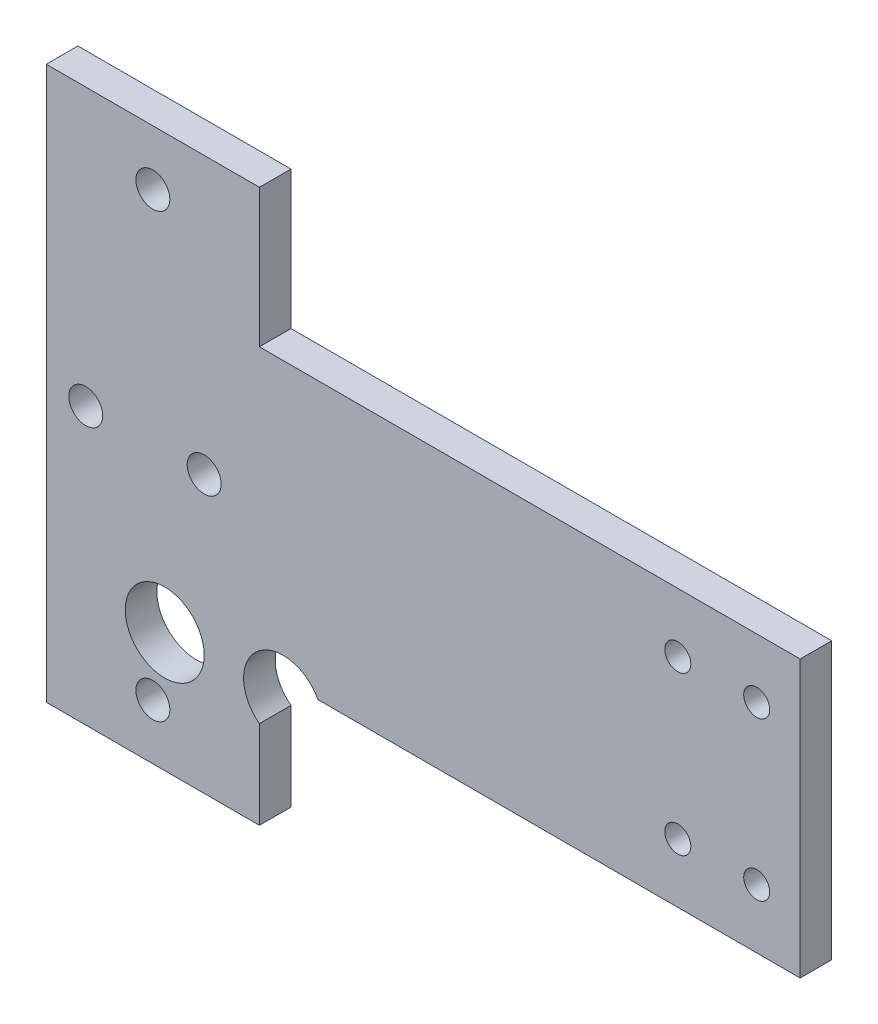
ISO-10303-21;
HEADER;
FILE_DESCRIPTION(('STEP AP214'),'2;1');
FILE_NAME('part.step','',(''),(''),'','','');
FILE_SCHEMA(('AUTOMOTIVE_DESIGN { 1 0 10303 214 1 1 1 1 }'));
ENDSEC;
DATA;
#1=APPLICATION_CONTEXT('core data for automotive mechanical design processes');
#2=APPLICATION_PROTOCOL_DEFINITION('international standard','automotive_design',2000,#1);
#3=PRODUCT_CONTEXT('',#1,'mechanical');
#4=PRODUCT('Part','Part','',(#3));
#5=PRODUCT_RELATED_PRODUCT_CATEGORY('part','',(#4));
#6=PRODUCT_DEFINITION_FORMATION('','',#4);
#7=PRODUCT_DEFINITION_CONTEXT('part definition',#1,'design');
#8=PRODUCT_DEFINITION('design','',#6,#7);
#9=PRODUCT_DEFINITION_SHAPE('','',#8);
#10=(LENGTH_UNIT() NAMED_UNIT(*) SI_UNIT(.MILLI.,.METRE.));
#11=(NAMED_UNIT(*) PLANE_ANGLE_UNIT() SI_UNIT($,.RADIAN.));
#12=(NAMED_UNIT(*) SI_UNIT($,.STERADIAN.) SOLID_ANGLE_UNIT());
#13=UNCERTAINTY_MEASURE_WITH_UNIT(LENGTH_MEASURE(1.E-05),#10,'distance_accuracy_value','');
#14=(GEOMETRIC_REPRESENTATION_CONTEXT(3) GLOBAL_UNCERTAINTY_ASSIGNED_CONTEXT((#13)) GLOBAL_UNIT_ASSIGNED_CONTEXT((#10,
#11,#12)) REPRESENTATION_CONTEXT('',''));
#15=CARTESIAN_POINT('',(0.,0.,0.));
#16=DIRECTION('',(0.,0.,1.));
#17=DIRECTION('',(1.,0.,0.));
#18=AXIS2_PLACEMENT_3D('',#15,#16,#17);
#19=CARTESIAN_POINT('',(0.,0.,4.));
#20=DIRECTION('',(0.,-1.,0.));
#21=DIRECTION('',(0.,0.,-1.));
#22=AXIS2_PLACEMENT_3D('',#19,#20,#21);
#23=PLANE('',#22);
#24=DIRECTION('',(-1.,0.,0.));
#25=VECTOR('',#24,1.);
#26=CARTESIAN_POINT('',(0.,0.,4.));
#27=LINE('',#26,#25);
#28=CARTESIAN_POINT('',(95.5,0.,4.));
#29=VERTEX_POINT('',#28);
#30=CARTESIAN_POINT('',(27.,0.,4.));
#31=VERTEX_POINT('',#30);
#32=EDGE_CURVE('E119',#29,#31,#27,.T.);
#33=ORIENTED_EDGE('',*,*,#32,.F.);
#34=DIRECTION('',(0.,0.,1.));
#35=VECTOR('',#34,1.);
#36=CARTESIAN_POINT('',(95.5,0.,-6.));
#37=LINE('',#36,#35);
#38=CARTESIAN_POINT('',(95.5,0.,0.));
#39=VERTEX_POINT('',#38);
#40=EDGE_CURVE('E107',#39,#29,#37,.T.);
#41=ORIENTED_EDGE('',*,*,#40,.F.);
#42=DIRECTION('',(-1.,0.,0.));
#43=VECTOR('',#42,1.);
#44=CARTESIAN_POINT('',(0.,0.,0.));
#45=LINE('',#44,#43);
#46=CARTESIAN_POINT('',(27.,0.,0.));
#47=VERTEX_POINT('',#46);
#48=EDGE_CURVE('E139',#39,#47,#45,.T.);
#49=ORIENTED_EDGE('',*,*,#48,.T.);
#50=DIRECTION('',(0.,0.,1.));
#51=VECTOR('',#50,1.);
#52=CARTESIAN_POINT('',(27.,0.,4.));
#53=LINE('',#52,#51);
#54=EDGE_CURVE('E126',#47,#31,#53,.T.);
#55=ORIENTED_EDGE('',*,*,#54,.T.);
#56=EDGE_LOOP('',(#33,#41,#49,#55));
#57=FACE_BOUND('',#56,.T.);
#58=ADVANCED_FACE('F40',(#57),#23,.F.);
#59=CARTESIAN_POINT('',(0.,0.,4.));
#60=DIRECTION('',(1.,0.,0.));
#61=DIRECTION('',(0.,1.,0.));
#62=AXIS2_PLACEMENT_3D('',#59,#60,#61);
#63=PLANE('',#62);
#64=DIRECTION('',(0.,-1.,0.));
#65=VECTOR('',#64,1.);
#66=CARTESIAN_POINT('',(0.,0.,0.));
#67=LINE('',#66,#65);
#68=CARTESIAN_POINT('',(0.,17.5,0.));
#69=VERTEX_POINT('',#68);
#70=CARTESIAN_POINT('',(0.,-52.5,0.));
#71=VERTEX_POINT('',#70);
#72=EDGE_CURVE('E132',#69,#71,#67,.T.);
#73=ORIENTED_EDGE('',*,*,#72,.T.);
#74=DIRECTION('',(0.,0.,1.));
#75=VECTOR('',#74,1.);
#76=CARTESIAN_POINT('',(0.,-52.5,0.));
#77=LINE('',#76,#75);
#78=CARTESIAN_POINT('',(0.,-52.5,4.));
#79=VERTEX_POINT('',#78);
#80=EDGE_CURVE('E189',#71,#79,#77,.T.);
#81=ORIENTED_EDGE('',*,*,#80,.T.);
#82=DIRECTION('',(0.,-1.,0.));
#83=VECTOR('',#82,1.);
#84=CARTESIAN_POINT('',(0.,0.,4.));
#85=LINE('',#84,#83);
#86=CARTESIAN_POINT('',(0.,17.5,4.));
#87=VERTEX_POINT('',#86);
#88=EDGE_CURVE('E127',#87,#79,#85,.T.);
#89=ORIENTED_EDGE('',*,*,#88,.F.);
#90=DIRECTION('',(0.,0.,1.));
#91=VECTOR('',#90,1.);
#92=CARTESIAN_POINT('',(0.,17.5,0.));
#93=LINE('',#92,#91);
#94=EDGE_CURVE('E198',#69,#87,#93,.T.);
#95=ORIENTED_EDGE('',*,*,#94,.F.);
#96=EDGE_LOOP('',(#73,#81,#89,#95));
#97=FACE_BOUND('',#96,.T.);
#98=ADVANCED_FACE('F249',(#97),#63,.F.);
#99=CARTESIAN_POINT('',(0.,-35.,4.));
#100=DIRECTION('',(0.,1.,0.));
#101=DIRECTION('',(0.,0.,1.));
#102=AXIS2_PLACEMENT_3D('',#99,#100,#101);
#103=PLANE('',#102);
#104=DIRECTION('',(1.,0.,0.));
#105=VECTOR('',#104,1.);
#106=CARTESIAN_POINT('',(0.,-35.,0.));
#107=LINE('',#106,#105);
#108=CARTESIAN_POINT('',(34.4186423254208,-35.,0.));
#109=VERTEX_POINT('',#108);
#110=CARTESIAN_POINT('',(95.5,-35.,0.));
#111=VERTEX_POINT('',#110);
#112=EDGE_CURVE('E128',#109,#111,#107,.T.);
#113=ORIENTED_EDGE('',*,*,#112,.T.);
#114=DIRECTION('',(0.,0.,1.));
#115=VECTOR('',#114,1.);
#116=CARTESIAN_POINT('',(95.5,-35.,-6.));
#117=LINE('',#116,#115);
#118=CARTESIAN_POINT('',(95.5,-35.,4.));
#119=VERTEX_POINT('',#118);
#120=EDGE_CURVE('E54',#111,#119,#117,.T.);
#121=ORIENTED_EDGE('',*,*,#120,.T.);
#122=DIRECTION('',(1.,0.,0.));
#123=VECTOR('',#122,1.);
#124=CARTESIAN_POINT('',(0.,-35.,4.));
#125=LINE('',#124,#123);
#126=CARTESIAN_POINT('',(34.4186423254208,-35.,4.));
#127=VERTEX_POINT('',#126);
#128=EDGE_CURVE('E122',#127,#119,#125,.T.);
#129=ORIENTED_EDGE('',*,*,#128,.F.);
#130=DIRECTION('',(0.,0.,1.));
#131=VECTOR('',#130,1.);
#132=CARTESIAN_POINT('',(34.4186423254208,-35.,0.));
#133=LINE('',#132,#131);
#134=EDGE_CURVE('E161',#127,#109,#133,.F.);
#135=ORIENTED_EDGE('',*,*,#134,.T.);
#136=EDGE_LOOP('',(#113,#121,#129,#135));
#137=FACE_BOUND('',#136,.T.);
#138=ADVANCED_FACE('F255',(#137),#103,.F.);
#139=CARTESIAN_POINT('',(0.,0.,4.));
#140=DIRECTION('',(0.,0.,1.));
#141=DIRECTION('',(1.,0.,0.));
#142=AXIS2_PLACEMENT_3D('',#139,#140,#141);
#143=PLANE('',#142);
#144=DIRECTION('',(0.,-1.,0.));
#145=VECTOR('',#144,1.);
#146=CARTESIAN_POINT('',(95.5,0.,4.));
#147=LINE('',#146,#145);
#148=EDGE_CURVE('E110',#29,#119,#147,.T.);
#149=ORIENTED_EDGE('',*,*,#148,.F.);
#150=ORIENTED_EDGE('',*,*,#32,.T.);
#151=DIRECTION('',(0.,1.,0.));
#152=VECTOR('',#151,1.);
#153=CARTESIAN_POINT('',(27.,17.5,4.));
#154=LINE('',#153,#152);
#155=CARTESIAN_POINT('',(27.,17.5,4.));
#156=VERTEX_POINT('',#155);
#157=EDGE_CURVE('E192',#31,#156,#154,.T.);
#158=ORIENTED_EDGE('',*,*,#157,.T.);
#159=DIRECTION('',(-1.,0.,0.));
#160=VECTOR('',#159,1.);
#161=CARTESIAN_POINT('',(0.,17.5,4.));
#162=LINE('',#161,#160);
#163=EDGE_CURVE('E182',#156,#87,#162,.T.);
#164=ORIENTED_EDGE('',*,*,#163,.T.);
#165=ORIENTED_EDGE('',*,*,#88,.T.);
#166=DIRECTION('',(1.,0.,0.));
#167=VECTOR('',#166,1.);
#168=CARTESIAN_POINT('',(0.,-52.5,4.));
#169=LINE('',#168,#167);
#170=CARTESIAN_POINT('',(27.,-52.5,4.));
#171=VERTEX_POINT('',#170);
#172=EDGE_CURVE('E175',#79,#171,#169,.T.);
#173=ORIENTED_EDGE('',*,*,#172,.T.);
#174=CARTESIAN_POINT('',(27.,-41.34,4.));
#175=VERTEX_POINT('',#174);
#176=EDGE_CURVE('E193',#171,#175,#154,.T.);
#177=ORIENTED_EDGE('',*,*,#176,.T.);
#178=CARTESIAN_POINT('',(30.,-37.34,4.));
#179=DIRECTION('',(0.,0.,1.));
#180=DIRECTION('',(1.,0.,0.));
#181=AXIS2_PLACEMENT_3D('',#178,#179,#180);
#182=CIRCLE('',#181,5.);
#183=EDGE_CURVE('E61',#127,#175,#182,.T.);
#184=ORIENTED_EDGE('',*,*,#183,.F.);
#185=ORIENTED_EDGE('',*,*,#128,.T.);
#186=EDGE_LOOP('',(#149,#150,#158,#164,#165,#173,#177,#184,#185));
#187=FACE_BOUND('',#186,.T.);
#188=CARTESIAN_POINT('',(90.,-7.49999999999999,4.));
#189=DIRECTION('',(0.,0.,1.));
#190=DIRECTION('',(1.,0.,0.));
#191=AXIS2_PLACEMENT_3D('',#188,#189,#190);
#192=CIRCLE('',#191,1.65);
#193=CARTESIAN_POINT('',(91.65,-7.49999999999999,4.));
#194=VERTEX_POINT('',#193);
#195=EDGE_CURVE('E147',#194,#194,#192,.T.);
#196=ORIENTED_EDGE('',*,*,#195,.F.);
#197=EDGE_LOOP('',(#196));
#198=FACE_BOUND('',#197,.T.);
#199=CARTESIAN_POINT('',(90.,-27.5,4.));
#200=DIRECTION('',(0.,0.,1.));
#201=DIRECTION('',(1.,0.,0.));
#202=AXIS2_PLACEMENT_3D('',#199,#200,#201);
#203=CIRCLE('',#202,1.65);
#204=CARTESIAN_POINT('',(91.65,-27.5,4.));
#205=VERTEX_POINT('',#204);
#206=EDGE_CURVE('E464',#205,#205,#203,.T.);
#207=ORIENTED_EDGE('',*,*,#206,.F.);
#208=EDGE_LOOP('',(#207));
#209=FACE_BOUND('',#208,.T.);
#210=CARTESIAN_POINT('',(15.,-37.34,4.));
#211=DIRECTION('',(0.,0.,1.));
#212=DIRECTION('',(1.,0.,0.));
#213=AXIS2_PLACEMENT_3D('',#210,#211,#212);
#214=CIRCLE('',#213,5.);
#215=CARTESIAN_POINT('',(20.,-37.34,4.));
#216=VERTEX_POINT('',#215);
#217=EDGE_CURVE('E153',#216,#216,#214,.T.);
#218=ORIENTED_EDGE('',*,*,#217,.F.);
#219=EDGE_LOOP('',(#218));
#220=FACE_BOUND('',#219,.T.);
#221=CARTESIAN_POINT('',(80.,-7.49999999999999,4.));
#222=DIRECTION('',(0.,0.,1.));
#223=DIRECTION('',(1.,0.,0.));
#224=AXIS2_PLACEMENT_3D('',#221,#222,#223);
#225=CIRCLE('',#224,1.65);
#226=CARTESIAN_POINT('',(81.65,-7.49999999999999,4.));
#227=VERTEX_POINT('',#226);
#228=EDGE_CURVE('E223',#227,#227,#225,.T.);
#229=ORIENTED_EDGE('',*,*,#228,.F.);
#230=EDGE_LOOP('',(#229));
#231=FACE_BOUND('',#230,.T.);
#232=CARTESIAN_POINT('',(80.,-27.5,4.));
#233=DIRECTION('',(0.,0.,1.));
#234=DIRECTION('',(-1.,0.,0.));
#235=AXIS2_PLACEMENT_3D('',#232,#233,#234);
#236=CIRCLE('',#235,1.65);
#237=CARTESIAN_POINT('',(78.35,-27.5,4.));
#238=VERTEX_POINT('',#237);
#239=EDGE_CURVE('E225',#238,#238,#236,.T.);
#240=ORIENTED_EDGE('',*,*,#239,.F.);
#241=EDGE_LOOP('',(#240));
#242=FACE_BOUND('',#241,.T.);
#243=CARTESIAN_POINT('',(20.,-17.5,4.));
#244=DIRECTION('',(0.,0.,1.));
#245=DIRECTION('',(1.,0.,0.));
#246=AXIS2_PLACEMENT_3D('',#243,#244,#245);
#247=CIRCLE('',#246,2.15);
#248=CARTESIAN_POINT('',(22.15,-17.5,4.));
#249=VERTEX_POINT('',#248);
#250=EDGE_CURVE('E216',#249,#249,#247,.T.);
#251=ORIENTED_EDGE('',*,*,#250,.F.);
#252=EDGE_LOOP('',(#251));
#253=FACE_BOUND('',#252,.T.);
#254=CARTESIAN_POINT('',(5.,-17.5,4.));
#255=DIRECTION('',(0.,0.,1.));
#256=DIRECTION('',(1.,0.,0.));
#257=AXIS2_PLACEMENT_3D('',#254,#255,#256);
#258=CIRCLE('',#257,2.15);
#259=CARTESIAN_POINT('',(7.15,-17.5,4.));
#260=VERTEX_POINT('',#259);
#261=EDGE_CURVE('E213',#260,#260,#258,.T.);
#262=ORIENTED_EDGE('',*,*,#261,.F.);
#263=EDGE_LOOP('',(#262));
#264=FACE_BOUND('',#263,.T.);
#265=CARTESIAN_POINT('',(13.5,-45.5,4.));
#266=DIRECTION('',(0.,0.,1.));
#267=DIRECTION('',(-1.,0.,0.));
#268=AXIS2_PLACEMENT_3D('',#265,#266,#267);
#269=CIRCLE('',#268,2.15);
#270=CARTESIAN_POINT('',(11.35,-45.5,4.));
#271=VERTEX_POINT('',#270);
#272=EDGE_CURVE('E164',#271,#271,#269,.T.);
#273=ORIENTED_EDGE('',*,*,#272,.F.);
#274=EDGE_LOOP('',(#273));
#275=FACE_BOUND('',#274,.T.);
#276=CARTESIAN_POINT('',(13.5,10.5,4.));
#277=DIRECTION('',(0.,0.,1.));
#278=DIRECTION('',(1.,0.,0.));
#279=AXIS2_PLACEMENT_3D('',#276,#277,#278);
#280=CIRCLE('',#279,2.15);
#281=CARTESIAN_POINT('',(15.65,10.5,4.));
#282=VERTEX_POINT('',#281);
#283=EDGE_CURVE('E169',#282,#282,#280,.T.);
#284=ORIENTED_EDGE('',*,*,#283,.F.);
#285=EDGE_LOOP('',(#284));
#286=FACE_BOUND('',#285,.T.);
#287=ADVANCED_FACE('F117',(#187,#198,#209,#220,#231,#242,#253,#264,#275,#286),#143,.T.);
#288=CARTESIAN_POINT('',(0.,0.,0.));
#289=DIRECTION('',(0.,0.,1.));
#290=DIRECTION('',(1.,0.,0.));
#291=AXIS2_PLACEMENT_3D('',#288,#289,#290);
#292=PLANE('',#291);
#293=CARTESIAN_POINT('',(90.,-7.49999999999999,0.));
#294=DIRECTION('',(0.,0.,1.));
#295=DIRECTION('',(1.,0.,0.));
#296=AXIS2_PLACEMENT_3D('',#293,#294,#295);
#297=CIRCLE('',#296,1.65);
#298=CARTESIAN_POINT('',(91.65,-7.49999999999999,0.));
#299=VERTEX_POINT('',#298);
#300=EDGE_CURVE('E146',#299,#299,#297,.T.);
#301=ORIENTED_EDGE('',*,*,#300,.T.);
#302=EDGE_LOOP('',(#301));
#303=FACE_BOUND('',#302,.T.);
#304=CARTESIAN_POINT('',(90.,-27.5,0.));
#305=DIRECTION('',(0.,0.,1.));
#306=DIRECTION('',(1.,0.,0.));
#307=AXIS2_PLACEMENT_3D('',#304,#305,#306);
#308=CIRCLE('',#307,1.65);
#309=CARTESIAN_POINT('',(91.65,-27.5,0.));
#310=VERTEX_POINT('',#309);
#311=EDGE_CURVE('E144',#310,#310,#308,.T.);
#312=ORIENTED_EDGE('',*,*,#311,.T.);
#313=EDGE_LOOP('',(#312));
#314=FACE_BOUND('',#313,.T.);
#315=CARTESIAN_POINT('',(15.,-37.34,0.));
#316=DIRECTION('',(0.,0.,1.));
#317=DIRECTION('',(1.,0.,0.));
#318=AXIS2_PLACEMENT_3D('',#315,#316,#317);
#319=CIRCLE('',#318,5.);
#320=CARTESIAN_POINT('',(20.,-37.34,0.));
#321=VERTEX_POINT('',#320);
#322=EDGE_CURVE('E149',#321,#321,#319,.T.);
#323=ORIENTED_EDGE('',*,*,#322,.T.);
#324=EDGE_LOOP('',(#323));
#325=FACE_BOUND('',#324,.T.);
#326=CARTESIAN_POINT('',(80.,-7.49999999999999,0.));
#327=DIRECTION('',(0.,0.,1.));
#328=DIRECTION('',(1.,0.,0.));
#329=AXIS2_PLACEMENT_3D('',#326,#327,#328);
#330=CIRCLE('',#329,1.65);
#331=CARTESIAN_POINT('',(81.65,-7.49999999999999,0.));
#332=VERTEX_POINT('',#331);
#333=EDGE_CURVE('E141',#332,#332,#330,.T.);
#334=ORIENTED_EDGE('',*,*,#333,.T.);
#335=EDGE_LOOP('',(#334));
#336=FACE_BOUND('',#335,.T.);
#337=CARTESIAN_POINT('',(80.,-27.5,0.));
#338=DIRECTION('',(0.,0.,1.));
#339=DIRECTION('',(-1.,0.,0.));
#340=AXIS2_PLACEMENT_3D('',#337,#338,#339);
#341=CIRCLE('',#340,1.65);
#342=CARTESIAN_POINT('',(78.35,-27.5,0.));
#343=VERTEX_POINT('',#342);
#344=EDGE_CURVE('E135',#343,#343,#341,.T.);
#345=ORIENTED_EDGE('',*,*,#344,.T.);
#346=EDGE_LOOP('',(#345));
#347=FACE_BOUND('',#346,.T.);
#348=ORIENTED_EDGE('',*,*,#48,.F.);
#349=DIRECTION('',(0.,-1.,0.));
#350=VECTOR('',#349,1.);
#351=CARTESIAN_POINT('',(95.5,0.,0.));
#352=LINE('',#351,#350);
#353=EDGE_CURVE('E11',#39,#111,#352,.T.);
#354=ORIENTED_EDGE('',*,*,#353,.T.);
#355=ORIENTED_EDGE('',*,*,#112,.F.);
#356=CARTESIAN_POINT('',(30.,-37.34,0.));
#357=DIRECTION('',(0.,0.,1.));
#358=DIRECTION('',(1.,0.,0.));
#359=AXIS2_PLACEMENT_3D('',#356,#357,#358);
#360=CIRCLE('',#359,5.);
#361=CARTESIAN_POINT('',(27.,-41.34,0.));
#362=VERTEX_POINT('',#361);
#363=EDGE_CURVE('E165',#109,#362,#360,.T.);
#364=ORIENTED_EDGE('',*,*,#363,.T.);
#365=DIRECTION('',(0.,1.,0.));
#366=VECTOR('',#365,1.);
#367=CARTESIAN_POINT('',(27.,17.5,0.));
#368=LINE('',#367,#366);
#369=CARTESIAN_POINT('',(27.,-52.5,0.));
#370=VERTEX_POINT('',#369);
#371=EDGE_CURVE('E183',#370,#362,#368,.T.);
#372=ORIENTED_EDGE('',*,*,#371,.F.);
#373=DIRECTION('',(1.,0.,0.));
#374=VECTOR('',#373,1.);
#375=CARTESIAN_POINT('',(0.,-52.5,0.));
#376=LINE('',#375,#374);
#377=EDGE_CURVE('E178',#71,#370,#376,.T.);
#378=ORIENTED_EDGE('',*,*,#377,.F.);
#379=ORIENTED_EDGE('',*,*,#72,.F.);
#380=DIRECTION('',(-1.,0.,0.));
#381=VECTOR('',#380,1.);
#382=CARTESIAN_POINT('',(0.,17.5,0.));
#383=LINE('',#382,#381);
#384=CARTESIAN_POINT('',(27.,17.5,0.));
#385=VERTEX_POINT('',#384);
#386=EDGE_CURVE('E186',#385,#69,#383,.T.);
#387=ORIENTED_EDGE('',*,*,#386,.F.);
#388=EDGE_CURVE('E181',#47,#385,#368,.T.);
#389=ORIENTED_EDGE('',*,*,#388,.F.);
#390=EDGE_LOOP('',(#348,#354,#355,#364,#372,#378,#379,#387,#389));
#391=FACE_BOUND('',#390,.T.);
#392=CARTESIAN_POINT('',(20.,-17.5,0.));
#393=DIRECTION('',(0.,0.,1.));
#394=DIRECTION('',(1.,0.,0.));
#395=AXIS2_PLACEMENT_3D('',#392,#393,#394);
#396=CIRCLE('',#395,2.15);
#397=CARTESIAN_POINT('',(22.15,-17.5,0.));
#398=VERTEX_POINT('',#397);
#399=EDGE_CURVE('E209',#398,#398,#396,.T.);
#400=ORIENTED_EDGE('',*,*,#399,.T.);
#401=EDGE_LOOP('',(#400));
#402=FACE_BOUND('',#401,.T.);
#403=CARTESIAN_POINT('',(5.,-17.5,0.));
#404=DIRECTION('',(0.,0.,1.));
#405=DIRECTION('',(1.,0.,0.));
#406=AXIS2_PLACEMENT_3D('',#403,#404,#405);
#407=CIRCLE('',#406,2.15);
#408=CARTESIAN_POINT('',(7.15,-17.5,0.));
#409=VERTEX_POINT('',#408);
#410=EDGE_CURVE('E210',#409,#409,#407,.T.);
#411=ORIENTED_EDGE('',*,*,#410,.T.);
#412=EDGE_LOOP('',(#411));
#413=FACE_BOUND('',#412,.T.);
#414=CARTESIAN_POINT('',(13.5,-45.5,0.));
#415=DIRECTION('',(0.,0.,1.));
#416=DIRECTION('',(-1.,0.,0.));
#417=AXIS2_PLACEMENT_3D('',#414,#415,#416);
#418=CIRCLE('',#417,2.15);
#419=CARTESIAN_POINT('',(11.35,-45.5,0.));
#420=VERTEX_POINT('',#419);
#421=EDGE_CURVE('E166',#420,#420,#418,.T.);
#422=ORIENTED_EDGE('',*,*,#421,.T.);
#423=EDGE_LOOP('',(#422));
#424=FACE_BOUND('',#423,.T.);
#425=CARTESIAN_POINT('',(13.5,10.5,0.));
#426=DIRECTION('',(0.,0.,1.));
#427=DIRECTION('',(1.,0.,0.));
#428=AXIS2_PLACEMENT_3D('',#425,#426,#427);
#429=CIRCLE('',#428,2.15);
#430=CARTESIAN_POINT('',(15.65,10.5,0.));
#431=VERTEX_POINT('',#430);
#432=EDGE_CURVE('E172',#431,#431,#429,.T.);
#433=ORIENTED_EDGE('',*,*,#432,.T.);
#434=EDGE_LOOP('',(#433));
#435=FACE_BOUND('',#434,.T.);
#436=ADVANCED_FACE('F232',(#303,#314,#325,#336,#347,#391,#402,#413,#424,#435),#292,.F.);
#437=CARTESIAN_POINT('',(80.,-27.5,0.));
#438=DIRECTION('',(0.,0.,1.));
#439=DIRECTION('',(1.,0.,0.));
#440=AXIS2_PLACEMENT_3D('',#437,#438,#439);
#441=CYLINDRICAL_SURFACE('',#440,1.65);
#442=ORIENTED_EDGE('',*,*,#344,.F.);
#443=EDGE_LOOP('',(#442));
#444=FACE_BOUND('',#443,.T.);
#445=ORIENTED_EDGE('',*,*,#239,.T.);
#446=EDGE_LOOP('',(#445));
#447=FACE_BOUND('',#446,.T.);
#448=ADVANCED_FACE('F235',(#444,#447),#441,.F.);
#449=CARTESIAN_POINT('',(80.,-7.49999999999999,0.));
#450=DIRECTION('',(0.,0.,1.));
#451=DIRECTION('',(1.,0.,0.));
#452=AXIS2_PLACEMENT_3D('',#449,#450,#451);
#453=CYLINDRICAL_SURFACE('',#452,1.65);
#454=ORIENTED_EDGE('',*,*,#333,.F.);
#455=EDGE_LOOP('',(#454));
#456=FACE_BOUND('',#455,.T.);
#457=ORIENTED_EDGE('',*,*,#228,.T.);
#458=EDGE_LOOP('',(#457));
#459=FACE_BOUND('',#458,.T.);
#460=ADVANCED_FACE('F237',(#456,#459),#453,.F.);
#461=CARTESIAN_POINT('',(20.,-17.5,0.));
#462=DIRECTION('',(0.,0.,1.));
#463=DIRECTION('',(1.,0.,0.));
#464=AXIS2_PLACEMENT_3D('',#461,#462,#463);
#465=CYLINDRICAL_SURFACE('',#464,2.15);
#466=ORIENTED_EDGE('',*,*,#399,.F.);
#467=EDGE_LOOP('',(#466));
#468=FACE_BOUND('',#467,.T.);
#469=ORIENTED_EDGE('',*,*,#250,.T.);
#470=EDGE_LOOP('',(#469));
#471=FACE_BOUND('',#470,.T.);
#472=ADVANCED_FACE('F242',(#468,#471),#465,.F.);
#473=CARTESIAN_POINT('',(5.,-17.5,0.));
#474=DIRECTION('',(0.,0.,1.));
#475=DIRECTION('',(1.,0.,0.));
#476=AXIS2_PLACEMENT_3D('',#473,#474,#475);
#477=CYLINDRICAL_SURFACE('',#476,2.15);
#478=ORIENTED_EDGE('',*,*,#410,.F.);
#479=EDGE_LOOP('',(#478));
#480=FACE_BOUND('',#479,.T.);
#481=ORIENTED_EDGE('',*,*,#261,.T.);
#482=EDGE_LOOP('',(#481));
#483=FACE_BOUND('',#482,.T.);
#484=ADVANCED_FACE('F376',(#480,#483),#477,.F.);
#485=CARTESIAN_POINT('',(0.,-52.5,0.));
#486=DIRECTION('',(0.,-1.,0.));
#487=DIRECTION('',(0.,0.,-1.));
#488=AXIS2_PLACEMENT_3D('',#485,#486,#487);
#489=PLANE('',#488);
#490=ORIENTED_EDGE('',*,*,#172,.F.);
#491=ORIENTED_EDGE('',*,*,#80,.F.);
#492=ORIENTED_EDGE('',*,*,#377,.T.);
#493=DIRECTION('',(0.,0.,1.));
#494=VECTOR('',#493,1.);
#495=CARTESIAN_POINT('',(27.,-52.5,0.));
#496=LINE('',#495,#494);
#497=EDGE_CURVE('E204',#370,#171,#496,.T.);
#498=ORIENTED_EDGE('',*,*,#497,.T.);
#499=EDGE_LOOP('',(#490,#491,#492,#498));
#500=FACE_BOUND('',#499,.T.);
#501=ADVANCED_FACE('F368',(#500),#489,.T.);
#502=CARTESIAN_POINT('',(13.5,-45.5,0.));
#503=DIRECTION('',(0.,0.,1.));
#504=DIRECTION('',(1.,0.,0.));
#505=AXIS2_PLACEMENT_3D('',#502,#503,#504);
#506=CYLINDRICAL_SURFACE('',#505,2.15);
#507=ORIENTED_EDGE('',*,*,#421,.F.);
#508=EDGE_LOOP('',(#507));
#509=FACE_BOUND('',#508,.T.);
#510=ORIENTED_EDGE('',*,*,#272,.T.);
#511=EDGE_LOOP('',(#510));
#512=FACE_BOUND('',#511,.T.);
#513=ADVANCED_FACE('F361',(#509,#512),#506,.F.);
#514=CARTESIAN_POINT('',(27.,17.5,0.));
#515=DIRECTION('',(1.,0.,0.));
#516=DIRECTION('',(0.,1.,0.));
#517=AXIS2_PLACEMENT_3D('',#514,#515,#516);
#518=PLANE('',#517);
#519=DIRECTION('',(0.,0.,1.));
#520=VECTOR('',#519,1.);
#521=CARTESIAN_POINT('',(27.,-41.34,0.));
#522=LINE('',#521,#520);
#523=EDGE_CURVE('E47',#175,#362,#522,.F.);
#524=ORIENTED_EDGE('',*,*,#523,.F.);
#525=ORIENTED_EDGE('',*,*,#176,.F.);
#526=ORIENTED_EDGE('',*,*,#497,.F.);
#527=ORIENTED_EDGE('',*,*,#371,.T.);
#528=EDGE_LOOP('',(#524,#525,#526,#527));
#529=FACE_BOUND('',#528,.T.);
#530=ADVANCED_FACE('F351',(#529),#518,.T.);
#531=ORIENTED_EDGE('',*,*,#54,.F.);
#532=ORIENTED_EDGE('',*,*,#388,.T.);
#533=DIRECTION('',(0.,0.,1.));
#534=VECTOR('',#533,1.);
#535=CARTESIAN_POINT('',(27.,17.5,0.));
#536=LINE('',#535,#534);
#537=EDGE_CURVE('E201',#385,#156,#536,.T.);
#538=ORIENTED_EDGE('',*,*,#537,.T.);
#539=ORIENTED_EDGE('',*,*,#157,.F.);
#540=EDGE_LOOP('',(#531,#532,#538,#539));
#541=FACE_BOUND('',#540,.T.);
#542=ADVANCED_FACE('F341',(#541),#518,.T.);
#543=CARTESIAN_POINT('',(0.,17.5,0.));
#544=DIRECTION('',(0.,1.,0.));
#545=DIRECTION('',(-1.,0.,0.));
#546=AXIS2_PLACEMENT_3D('',#543,#544,#545);
#547=PLANE('',#546);
#548=ORIENTED_EDGE('',*,*,#163,.F.);
#549=ORIENTED_EDGE('',*,*,#537,.F.);
#550=ORIENTED_EDGE('',*,*,#386,.T.);
#551=ORIENTED_EDGE('',*,*,#94,.T.);
#552=EDGE_LOOP('',(#548,#549,#550,#551));
#553=FACE_BOUND('',#552,.T.);
#554=ADVANCED_FACE('F331',(#553),#547,.T.);
#555=CARTESIAN_POINT('',(13.5,10.5,0.));
#556=DIRECTION('',(0.,0.,1.));
#557=DIRECTION('',(1.,0.,0.));
#558=AXIS2_PLACEMENT_3D('',#555,#556,#557);
#559=CYLINDRICAL_SURFACE('',#558,2.15);
#560=ORIENTED_EDGE('',*,*,#432,.F.);
#561=EDGE_LOOP('',(#560));
#562=FACE_BOUND('',#561,.T.);
#563=ORIENTED_EDGE('',*,*,#283,.T.);
#564=EDGE_LOOP('',(#563));
#565=FACE_BOUND('',#564,.T.);
#566=ADVANCED_FACE('F321',(#562,#565),#559,.F.);
#567=CARTESIAN_POINT('',(30.,-37.34,0.));
#568=DIRECTION('',(0.,0.,1.));
#569=DIRECTION('',(1.,0.,0.));
#570=AXIS2_PLACEMENT_3D('',#567,#568,#569);
#571=CYLINDRICAL_SURFACE('',#570,5.);
#572=ORIENTED_EDGE('',*,*,#183,.T.);
#573=ORIENTED_EDGE('',*,*,#523,.T.);
#574=ORIENTED_EDGE('',*,*,#363,.F.);
#575=ORIENTED_EDGE('',*,*,#134,.F.);
#576=EDGE_LOOP('',(#572,#573,#574,#575));
#577=FACE_BOUND('',#576,.T.);
#578=ADVANCED_FACE('F311',(#577),#571,.F.);
#579=CARTESIAN_POINT('',(15.,-37.34,0.));
#580=DIRECTION('',(0.,0.,1.));
#581=DIRECTION('',(1.,0.,0.));
#582=AXIS2_PLACEMENT_3D('',#579,#580,#581);
#583=CYLINDRICAL_SURFACE('',#582,5.);
#584=ORIENTED_EDGE('',*,*,#322,.F.);
#585=EDGE_LOOP('',(#584));
#586=FACE_BOUND('',#585,.T.);
#587=ORIENTED_EDGE('',*,*,#217,.T.);
#588=EDGE_LOOP('',(#587));
#589=FACE_BOUND('',#588,.T.);
#590=ADVANCED_FACE('F301',(#586,#589),#583,.F.);
#591=CARTESIAN_POINT('',(90.,-27.5,-6.));
#592=DIRECTION('',(0.,0.,1.));
#593=DIRECTION('',(1.,0.,0.));
#594=AXIS2_PLACEMENT_3D('',#591,#592,#593);
#595=CYLINDRICAL_SURFACE('',#594,1.65);
#596=ORIENTED_EDGE('',*,*,#206,.T.);
#597=EDGE_LOOP('',(#596));
#598=FACE_BOUND('',#597,.T.);
#599=ORIENTED_EDGE('',*,*,#311,.F.);
#600=EDGE_LOOP('',(#599));
#601=FACE_BOUND('',#600,.T.);
#602=ADVANCED_FACE('F291',(#598,#601),#595,.F.);
#603=CARTESIAN_POINT('',(90.,-7.49999999999999,-6.));
#604=DIRECTION('',(0.,0.,1.));
#605=DIRECTION('',(1.,0.,0.));
#606=AXIS2_PLACEMENT_3D('',#603,#604,#605);
#607=CYLINDRICAL_SURFACE('',#606,1.65);
#608=ORIENTED_EDGE('',*,*,#195,.T.);
#609=EDGE_LOOP('',(#608));
#610=FACE_BOUND('',#609,.T.);
#611=ORIENTED_EDGE('',*,*,#300,.F.);
#612=EDGE_LOOP('',(#611));
#613=FACE_BOUND('',#612,.T.);
#614=ADVANCED_FACE('F280',(#610,#613),#607,.F.);
#615=CARTESIAN_POINT('',(95.5,0.,-6.));
#616=DIRECTION('',(-1.,0.,0.));
#617=DIRECTION('',(0.,0.,1.));
#618=AXIS2_PLACEMENT_3D('',#615,#616,#617);
#619=PLANE('',#618);
#620=ORIENTED_EDGE('',*,*,#40,.T.);
#621=ORIENTED_EDGE('',*,*,#148,.T.);
#622=ORIENTED_EDGE('',*,*,#120,.F.);
#623=ORIENTED_EDGE('',*,*,#353,.F.);
#624=EDGE_LOOP('',(#620,#621,#622,#623));
#625=FACE_BOUND('',#624,.T.);
#626=ADVANCED_FACE('F109',(#625),#619,.F.);
#627=CLOSED_SHELL('',(#58,#98,#138,#287,#436,#448,#460,#472,#484,#501,#513,#530,#542,#554,#566,
#578,#590,#602,#614,#626));
#628=MANIFOLD_SOLID_BREP('B2',#627);
#629=ADVANCED_BREP_SHAPE_REPRESENTATION('',(#18,#628),#14);
#630=SHAPE_DEFINITION_REPRESENTATION(#9,#629);
ENDSEC;
END-ISO-10303-21;
